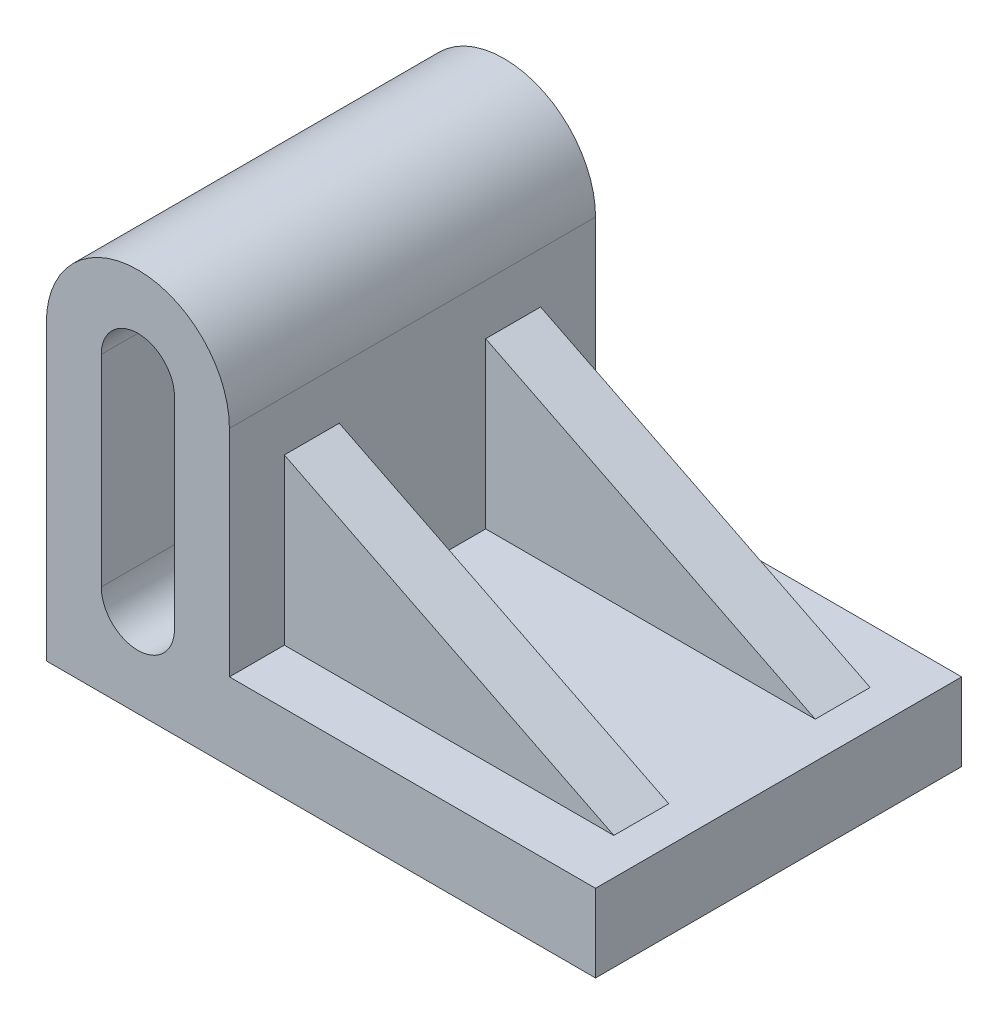
ISO-10303-21;
HEADER;
FILE_DESCRIPTION(('STEP AP214'),'2;1');
FILE_NAME('part.step','',(''),(''),'','','');
FILE_SCHEMA(('AUTOMOTIVE_DESIGN { 1 0 10303 214 1 1 1 1 }'));
ENDSEC;
DATA;
#1=APPLICATION_CONTEXT('core data for automotive mechanical design processes');
#2=APPLICATION_PROTOCOL_DEFINITION('international standard','automotive_design',2000,#1);
#3=PRODUCT_CONTEXT('',#1,'mechanical');
#4=PRODUCT('Part','Part','',(#3));
#5=PRODUCT_RELATED_PRODUCT_CATEGORY('part','',(#4));
#6=PRODUCT_DEFINITION_FORMATION('','',#4);
#7=PRODUCT_DEFINITION_CONTEXT('part definition',#1,'design');
#8=PRODUCT_DEFINITION('design','',#6,#7);
#9=PRODUCT_DEFINITION_SHAPE('','',#8);
#10=(LENGTH_UNIT() NAMED_UNIT(*) SI_UNIT(.MILLI.,.METRE.));
#11=(NAMED_UNIT(*) PLANE_ANGLE_UNIT() SI_UNIT($,.RADIAN.));
#12=(NAMED_UNIT(*) SI_UNIT($,.STERADIAN.) SOLID_ANGLE_UNIT());
#13=UNCERTAINTY_MEASURE_WITH_UNIT(LENGTH_MEASURE(1.E-05),#10,'distance_accuracy_value','');
#14=(GEOMETRIC_REPRESENTATION_CONTEXT(3) GLOBAL_UNCERTAINTY_ASSIGNED_CONTEXT((#13)) GLOBAL_UNIT_ASSIGNED_CONTEXT((#10,
#11,#12)) REPRESENTATION_CONTEXT('',''));
#15=CARTESIAN_POINT('',(0.,0.,0.));
#16=DIRECTION('',(0.,0.,1.));
#17=DIRECTION('',(1.,0.,0.));
#18=AXIS2_PLACEMENT_3D('',#15,#16,#17);
#19=CARTESIAN_POINT('',(140.,21.2228289339933,-35.));
#20=DIRECTION('',(0.447213595499958,0.894427190999916,0.));
#21=DIRECTION('',(-0.894427190999916,0.447213595499958,0.));
#22=AXIS2_PLACEMENT_3D('',#19,#20,#21);
#23=PLANE('',#22);
#24=DIRECTION('',(0.,0.,1.));
#25=VECTOR('',#24,1.);
#26=CARTESIAN_POINT('',(140.,21.2228289339933,-35.));
#27=LINE('',#26,#25);
#28=CARTESIAN_POINT('',(140.,21.2228289339933,20.));
#29=VERTEX_POINT('',#28);
#30=CARTESIAN_POINT('',(140.,21.2228289339933,35.));
#31=VERTEX_POINT('',#30);
#32=EDGE_CURVE('E194',#29,#31,#27,.T.);
#33=ORIENTED_EDGE('',*,*,#32,.F.);
#34=DIRECTION('',(-0.894427190999916,0.447213595499958,0.));
#35=VECTOR('',#34,1.);
#36=CARTESIAN_POINT('',(140.,21.2228289339933,20.));
#37=LINE('',#36,#35);
#38=CARTESIAN_POINT('',(50.,66.2228289339933,20.));
#39=VERTEX_POINT('',#38);
#40=EDGE_CURVE('E11',#29,#39,#37,.T.);
#41=ORIENTED_EDGE('',*,*,#40,.T.);
#42=DIRECTION('',(0.,0.,1.));
#43=VECTOR('',#42,1.);
#44=CARTESIAN_POINT('',(50.,66.2228289339933,-35.));
#45=LINE('',#44,#43);
#46=CARTESIAN_POINT('',(50.,66.2228289339933,35.));
#47=VERTEX_POINT('',#46);
#48=EDGE_CURVE('E161',#39,#47,#45,.T.);
#49=ORIENTED_EDGE('',*,*,#48,.T.);
#50=DIRECTION('',(-0.894427190999916,0.447213595499958,0.));
#51=VECTOR('',#50,1.);
#52=CARTESIAN_POINT('',(140.,21.2228289339933,35.));
#53=LINE('',#52,#51);
#54=EDGE_CURVE('E162',#31,#47,#53,.T.);
#55=ORIENTED_EDGE('',*,*,#54,.F.);
#56=EDGE_LOOP('',(#33,#41,#49,#55));
#57=FACE_BOUND('',#56,.T.);
#58=ADVANCED_FACE('F39',(#57),#23,.T.);
#59=CARTESIAN_POINT('',(50.,66.2228289339933,-35.));
#60=VERTEX_POINT('',#59);
#61=CARTESIAN_POINT('',(50.,66.2228289339933,-20.));
#62=VERTEX_POINT('',#61);
#63=EDGE_CURVE('E198',#60,#62,#45,.T.);
#64=ORIENTED_EDGE('',*,*,#63,.T.);
#65=DIRECTION('',(0.894427190999916,-0.447213595499958,0.));
#66=VECTOR('',#65,1.);
#67=CARTESIAN_POINT('',(140.,21.2228289339933,-20.));
#68=LINE('',#67,#66);
#69=CARTESIAN_POINT('',(140.,21.2228289339933,-20.));
#70=VERTEX_POINT('',#69);
#71=EDGE_CURVE('E50',#62,#70,#68,.T.);
#72=ORIENTED_EDGE('',*,*,#71,.T.);
#73=CARTESIAN_POINT('',(140.,21.2228289339933,-35.));
#74=VERTEX_POINT('',#73);
#75=EDGE_CURVE('E195',#74,#70,#27,.T.);
#76=ORIENTED_EDGE('',*,*,#75,.F.);
#77=DIRECTION('',(-0.894427190999916,0.447213595499958,0.));
#78=VECTOR('',#77,1.);
#79=CARTESIAN_POINT('',(140.,21.2228289339933,-35.));
#80=LINE('',#79,#78);
#81=EDGE_CURVE('E64',#74,#60,#80,.T.);
#82=ORIENTED_EDGE('',*,*,#81,.T.);
#83=EDGE_LOOP('',(#64,#72,#76,#82));
#84=FACE_BOUND('',#83,.T.);
#85=ADVANCED_FACE('F275',(#84),#23,.T.);
#86=CARTESIAN_POINT('',(150.,21.2228289339933,50.));
#87=DIRECTION('',(0.,-1.,0.));
#88=DIRECTION('',(0.,0.,-1.));
#89=AXIS2_PLACEMENT_3D('',#86,#87,#88);
#90=PLANE('',#89);
#91=ORIENTED_EDGE('',*,*,#75,.T.);
#92=DIRECTION('',(-1.,0.,0.));
#93=VECTOR('',#92,1.);
#94=CARTESIAN_POINT('',(50.,21.2228289339933,-20.));
#95=LINE('',#94,#93);
#96=CARTESIAN_POINT('',(50.,21.2228289339933,-20.));
#97=VERTEX_POINT('',#96);
#98=EDGE_CURVE('E53',#70,#97,#95,.T.);
#99=ORIENTED_EDGE('',*,*,#98,.T.);
#100=DIRECTION('',(0.,0.,1.));
#101=VECTOR('',#100,1.);
#102=CARTESIAN_POINT('',(50.,21.2228289339933,-20.));
#103=LINE('',#102,#101);
#104=CARTESIAN_POINT('',(50.,21.2228289339933,20.));
#105=VERTEX_POINT('',#104);
#106=EDGE_CURVE('E157',#97,#105,#103,.T.);
#107=ORIENTED_EDGE('',*,*,#106,.T.);
#108=DIRECTION('',(1.,0.,0.));
#109=VECTOR('',#108,1.);
#110=CARTESIAN_POINT('',(50.,21.2228289339933,20.));
#111=LINE('',#110,#109);
#112=EDGE_CURVE('E170',#105,#29,#111,.T.);
#113=ORIENTED_EDGE('',*,*,#112,.T.);
#114=ORIENTED_EDGE('',*,*,#32,.T.);
#115=DIRECTION('',(1.,0.,0.));
#116=VECTOR('',#115,1.);
#117=CARTESIAN_POINT('',(50.,21.2228289339933,35.));
#118=LINE('',#117,#116);
#119=CARTESIAN_POINT('',(50.,21.2228289339933,35.));
#120=VERTEX_POINT('',#119);
#121=EDGE_CURVE('E185',#120,#31,#118,.T.);
#122=ORIENTED_EDGE('',*,*,#121,.F.);
#123=DIRECTION('',(0.,0.,-1.));
#124=VECTOR('',#123,1.);
#125=CARTESIAN_POINT('',(50.,21.2228289339933,50.));
#126=LINE('',#125,#124);
#127=CARTESIAN_POINT('',(50.,21.2228289339933,50.));
#128=VERTEX_POINT('',#127);
#129=EDGE_CURVE('E262',#128,#120,#126,.T.);
#130=ORIENTED_EDGE('',*,*,#129,.F.);
#131=DIRECTION('',(-1.,0.,0.));
#132=VECTOR('',#131,1.);
#133=CARTESIAN_POINT('',(150.,21.2228289339933,50.));
#134=LINE('',#133,#132);
#135=CARTESIAN_POINT('',(150.,21.2228289339933,50.));
#136=VERTEX_POINT('',#135);
#137=EDGE_CURVE('E251',#136,#128,#134,.T.);
#138=ORIENTED_EDGE('',*,*,#137,.F.);
#139=DIRECTION('',(0.,0.,-1.));
#140=VECTOR('',#139,1.);
#141=CARTESIAN_POINT('',(150.,21.2228289339933,50.));
#142=LINE('',#141,#140);
#143=CARTESIAN_POINT('',(150.,21.2228289339933,-50.));
#144=VERTEX_POINT('',#143);
#145=EDGE_CURVE('E270',#136,#144,#142,.T.);
#146=ORIENTED_EDGE('',*,*,#145,.T.);
#147=DIRECTION('',(-1.,0.,0.));
#148=VECTOR('',#147,1.);
#149=CARTESIAN_POINT('',(150.,21.2228289339933,-50.));
#150=LINE('',#149,#148);
#151=CARTESIAN_POINT('',(50.,21.2228289339933,-50.));
#152=VERTEX_POINT('',#151);
#153=EDGE_CURVE('E236',#144,#152,#150,.T.);
#154=ORIENTED_EDGE('',*,*,#153,.T.);
#155=CARTESIAN_POINT('',(50.,21.2228289339933,-35.));
#156=VERTEX_POINT('',#155);
#157=EDGE_CURVE('E263',#156,#152,#126,.T.);
#158=ORIENTED_EDGE('',*,*,#157,.F.);
#159=DIRECTION('',(1.,0.,0.));
#160=VECTOR('',#159,1.);
#161=CARTESIAN_POINT('',(50.,21.2228289339933,-35.));
#162=LINE('',#161,#160);
#163=EDGE_CURVE('E190',#156,#74,#162,.T.);
#164=ORIENTED_EDGE('',*,*,#163,.T.);
#165=EDGE_LOOP('',(#91,#99,#107,#113,#114,#122,#130,#138,#146,#154,#158,#164));
#166=FACE_BOUND('',#165,.T.);
#167=ADVANCED_FACE('F172',(#166),#90,.F.);
#168=CARTESIAN_POINT('',(50.,21.2228289339933,50.));
#169=DIRECTION('',(-1.,0.,0.));
#170=DIRECTION('',(0.,0.,1.));
#171=AXIS2_PLACEMENT_3D('',#168,#169,#170);
#172=PLANE('',#171);
#173=DIRECTION('',(0.,1.,0.));
#174=VECTOR('',#173,1.);
#175=CARTESIAN_POINT('',(50.,21.2228289339933,-50.));
#176=LINE('',#175,#174);
#177=CARTESIAN_POINT('',(50.,80.,-50.));
#178=VERTEX_POINT('',#177);
#179=EDGE_CURVE('E243',#152,#178,#176,.T.);
#180=ORIENTED_EDGE('',*,*,#179,.T.);
#181=DIRECTION('',(0.,0.,-1.));
#182=VECTOR('',#181,1.);
#183=CARTESIAN_POINT('',(50.,80.,50.));
#184=LINE('',#183,#182);
#185=CARTESIAN_POINT('',(50.,80.,50.));
#186=VERTEX_POINT('',#185);
#187=EDGE_CURVE('E261',#186,#178,#184,.T.);
#188=ORIENTED_EDGE('',*,*,#187,.F.);
#189=DIRECTION('',(0.,1.,0.));
#190=VECTOR('',#189,1.);
#191=CARTESIAN_POINT('',(50.,21.2228289339933,50.));
#192=LINE('',#191,#190);
#193=EDGE_CURVE('E254',#128,#186,#192,.T.);
#194=ORIENTED_EDGE('',*,*,#193,.F.);
#195=ORIENTED_EDGE('',*,*,#129,.T.);
#196=DIRECTION('',(0.,-1.,0.));
#197=VECTOR('',#196,1.);
#198=CARTESIAN_POINT('',(50.,66.2228289339933,35.));
#199=LINE('',#198,#197);
#200=EDGE_CURVE('E179',#47,#120,#199,.T.);
#201=ORIENTED_EDGE('',*,*,#200,.F.);
#202=ORIENTED_EDGE('',*,*,#48,.F.);
#203=DIRECTION('',(0.,-1.,0.));
#204=VECTOR('',#203,1.);
#205=CARTESIAN_POINT('',(50.,105.,20.));
#206=LINE('',#205,#204);
#207=EDGE_CURVE('E153',#39,#105,#206,.T.);
#208=ORIENTED_EDGE('',*,*,#207,.T.);
#209=ORIENTED_EDGE('',*,*,#106,.F.);
#210=DIRECTION('',(0.,-1.,0.));
#211=VECTOR('',#210,1.);
#212=CARTESIAN_POINT('',(50.,105.,-20.));
#213=LINE('',#212,#211);
#214=EDGE_CURVE('E163',#62,#97,#213,.T.);
#215=ORIENTED_EDGE('',*,*,#214,.F.);
#216=ORIENTED_EDGE('',*,*,#63,.F.);
#217=DIRECTION('',(0.,-1.,0.));
#218=VECTOR('',#217,1.);
#219=CARTESIAN_POINT('',(50.,66.2228289339933,-35.));
#220=LINE('',#219,#218);
#221=EDGE_CURVE('E188',#60,#156,#220,.T.);
#222=ORIENTED_EDGE('',*,*,#221,.T.);
#223=ORIENTED_EDGE('',*,*,#157,.T.);
#224=EDGE_LOOP('',(#180,#188,#194,#195,#201,#202,#208,#209,#215,#216,#222,#223));
#225=FACE_BOUND('',#224,.T.);
#226=ADVANCED_FACE('F156',(#225),#172,.F.);
#227=CARTESIAN_POINT('',(0.,0.,50.));
#228=DIRECTION('',(1.,0.,0.));
#229=DIRECTION('',(0.,0.,-1.));
#230=AXIS2_PLACEMENT_3D('',#227,#228,#229);
#231=PLANE('',#230);
#232=DIRECTION('',(0.,0.,-1.));
#233=VECTOR('',#232,1.);
#234=CARTESIAN_POINT('',(0.,80.,50.));
#235=LINE('',#234,#233);
#236=CARTESIAN_POINT('',(0.,80.,50.));
#237=VERTEX_POINT('',#236);
#238=CARTESIAN_POINT('',(0.,80.,-50.));
#239=VERTEX_POINT('',#238);
#240=EDGE_CURVE('E259',#237,#239,#235,.T.);
#241=ORIENTED_EDGE('',*,*,#240,.T.);
#242=DIRECTION('',(0.,-1.,0.));
#243=VECTOR('',#242,1.);
#244=CARTESIAN_POINT('',(0.,0.,-50.));
#245=LINE('',#244,#243);
#246=CARTESIAN_POINT('',(0.,0.,-50.));
#247=VERTEX_POINT('',#246);
#248=EDGE_CURVE('E224',#239,#247,#245,.T.);
#249=ORIENTED_EDGE('',*,*,#248,.T.);
#250=DIRECTION('',(0.,0.,-1.));
#251=VECTOR('',#250,1.);
#252=CARTESIAN_POINT('',(0.,0.,50.));
#253=LINE('',#252,#251);
#254=CARTESIAN_POINT('',(0.,0.,50.));
#255=VERTEX_POINT('',#254);
#256=EDGE_CURVE('E271',#255,#247,#253,.T.);
#257=ORIENTED_EDGE('',*,*,#256,.F.);
#258=DIRECTION('',(0.,-1.,0.));
#259=VECTOR('',#258,1.);
#260=CARTESIAN_POINT('',(0.,0.,50.));
#261=LINE('',#260,#259);
#262=EDGE_CURVE('E246',#237,#255,#261,.T.);
#263=ORIENTED_EDGE('',*,*,#262,.F.);
#264=EDGE_LOOP('',(#241,#249,#257,#263));
#265=FACE_BOUND('',#264,.T.);
#266=ADVANCED_FACE('F41',(#265),#231,.F.);
#267=CARTESIAN_POINT('',(0.,0.,50.));
#268=DIRECTION('',(0.,1.,0.));
#269=DIRECTION('',(0.,0.,1.));
#270=AXIS2_PLACEMENT_3D('',#267,#268,#269);
#271=PLANE('',#270);
#272=ORIENTED_EDGE('',*,*,#256,.T.);
#273=DIRECTION('',(1.,0.,0.));
#274=VECTOR('',#273,1.);
#275=CARTESIAN_POINT('',(0.,0.,-50.));
#276=LINE('',#275,#274);
#277=CARTESIAN_POINT('',(150.,0.,-50.));
#278=VERTEX_POINT('',#277);
#279=EDGE_CURVE('E235',#247,#278,#276,.T.);
#280=ORIENTED_EDGE('',*,*,#279,.T.);
#281=DIRECTION('',(0.,0.,-1.));
#282=VECTOR('',#281,1.);
#283=CARTESIAN_POINT('',(150.,0.,50.));
#284=LINE('',#283,#282);
#285=CARTESIAN_POINT('',(150.,0.,50.));
#286=VERTEX_POINT('',#285);
#287=EDGE_CURVE('E267',#286,#278,#284,.T.);
#288=ORIENTED_EDGE('',*,*,#287,.F.);
#289=DIRECTION('',(1.,0.,0.));
#290=VECTOR('',#289,1.);
#291=CARTESIAN_POINT('',(0.,0.,50.));
#292=LINE('',#291,#290);
#293=EDGE_CURVE('E248',#255,#286,#292,.T.);
#294=ORIENTED_EDGE('',*,*,#293,.F.);
#295=EDGE_LOOP('',(#272,#280,#288,#294));
#296=FACE_BOUND('',#295,.T.);
#297=ADVANCED_FACE('F329',(#296),#271,.F.);
#298=CARTESIAN_POINT('',(150.,0.,50.));
#299=DIRECTION('',(-1.,0.,0.));
#300=DIRECTION('',(0.,0.,1.));
#301=AXIS2_PLACEMENT_3D('',#298,#299,#300);
#302=PLANE('',#301);
#303=ORIENTED_EDGE('',*,*,#287,.T.);
#304=DIRECTION('',(0.,1.,0.));
#305=VECTOR('',#304,1.);
#306=CARTESIAN_POINT('',(150.,0.,-50.));
#307=LINE('',#306,#305);
#308=EDGE_CURVE('E234',#278,#144,#307,.T.);
#309=ORIENTED_EDGE('',*,*,#308,.T.);
#310=ORIENTED_EDGE('',*,*,#145,.F.);
#311=DIRECTION('',(0.,1.,0.));
#312=VECTOR('',#311,1.);
#313=CARTESIAN_POINT('',(150.,0.,50.));
#314=LINE('',#313,#312);
#315=EDGE_CURVE('E253',#286,#136,#314,.T.);
#316=ORIENTED_EDGE('',*,*,#315,.F.);
#317=EDGE_LOOP('',(#303,#309,#310,#316));
#318=FACE_BOUND('',#317,.T.);
#319=ADVANCED_FACE('F323',(#318),#302,.F.);
#320=CARTESIAN_POINT('',(25.,80.,50.));
#321=DIRECTION('',(0.,0.,-1.));
#322=DIRECTION('',(-1.,0.,0.));
#323=AXIS2_PLACEMENT_3D('',#320,#321,#322);
#324=CYLINDRICAL_SURFACE('',#323,25.);
#325=ORIENTED_EDGE('',*,*,#187,.T.);
#326=CARTESIAN_POINT('',(25.,80.,-50.));
#327=DIRECTION('',(0.,0.,1.));
#328=DIRECTION('',(1.,0.,0.));
#329=AXIS2_PLACEMENT_3D('',#326,#327,#328);
#330=CIRCLE('',#329,25.);
#331=EDGE_CURVE('E242',#178,#239,#330,.T.);
#332=ORIENTED_EDGE('',*,*,#331,.T.);
#333=ORIENTED_EDGE('',*,*,#240,.F.);
#334=CARTESIAN_POINT('',(25.,80.,50.));
#335=DIRECTION('',(0.,0.,1.));
#336=DIRECTION('',(1.,0.,0.));
#337=AXIS2_PLACEMENT_3D('',#334,#335,#336);
#338=CIRCLE('',#337,25.);
#339=EDGE_CURVE('E260',#186,#237,#338,.T.);
#340=ORIENTED_EDGE('',*,*,#339,.F.);
#341=EDGE_LOOP('',(#325,#332,#333,#340));
#342=FACE_BOUND('',#341,.T.);
#343=ADVANCED_FACE('F317',(#342),#324,.T.);
#344=CARTESIAN_POINT('',(25.,80.,50.));
#345=DIRECTION('',(0.,0.,1.));
#346=DIRECTION('',(1.,0.,0.));
#347=AXIS2_PLACEMENT_3D('',#344,#345,#346);
#348=PLANE('',#347);
#349=CARTESIAN_POINT('',(25.,80.,50.));
#350=DIRECTION('',(0.,0.,1.));
#351=DIRECTION('',(1.,0.,0.));
#352=AXIS2_PLACEMENT_3D('',#349,#350,#351);
#353=CIRCLE('',#352,9.99999999999999);
#354=CARTESIAN_POINT('',(35.,80.,50.));
#355=VERTEX_POINT('',#354);
#356=CARTESIAN_POINT('',(15.,80.,50.));
#357=VERTEX_POINT('',#356);
#358=EDGE_CURVE('E193',#355,#357,#353,.T.);
#359=ORIENTED_EDGE('',*,*,#358,.F.);
#360=DIRECTION('',(0.,1.,0.));
#361=VECTOR('',#360,1.);
#362=CARTESIAN_POINT('',(35.,80.,50.));
#363=LINE('',#362,#361);
#364=CARTESIAN_POINT('',(35.,25.,50.));
#365=VERTEX_POINT('',#364);
#366=EDGE_CURVE('E205',#365,#355,#363,.T.);
#367=ORIENTED_EDGE('',*,*,#366,.F.);
#368=CARTESIAN_POINT('',(25.,25.,50.));
#369=DIRECTION('',(0.,0.,1.));
#370=DIRECTION('',(1.,0.,0.));
#371=AXIS2_PLACEMENT_3D('',#368,#369,#370);
#372=CIRCLE('',#371,10.);
#373=CARTESIAN_POINT('',(15.,25.,50.));
#374=VERTEX_POINT('',#373);
#375=EDGE_CURVE('E216',#374,#365,#372,.T.);
#376=ORIENTED_EDGE('',*,*,#375,.F.);
#377=DIRECTION('',(0.,-1.,0.));
#378=VECTOR('',#377,1.);
#379=CARTESIAN_POINT('',(15.,80.,50.));
#380=LINE('',#379,#378);
#381=EDGE_CURVE('E213',#357,#374,#380,.T.);
#382=ORIENTED_EDGE('',*,*,#381,.F.);
#383=EDGE_LOOP('',(#359,#367,#376,#382));
#384=FACE_BOUND('',#383,.T.);
#385=ORIENTED_EDGE('',*,*,#262,.T.);
#386=ORIENTED_EDGE('',*,*,#293,.T.);
#387=ORIENTED_EDGE('',*,*,#315,.T.);
#388=ORIENTED_EDGE('',*,*,#137,.T.);
#389=ORIENTED_EDGE('',*,*,#193,.T.);
#390=ORIENTED_EDGE('',*,*,#339,.T.);
#391=EDGE_LOOP('',(#385,#386,#387,#388,#389,#390));
#392=FACE_BOUND('',#391,.T.);
#393=ADVANCED_FACE('F312',(#384,#392),#348,.T.);
#394=CARTESIAN_POINT('',(25.,80.,-50.));
#395=DIRECTION('',(0.,0.,1.));
#396=DIRECTION('',(1.,0.,0.));
#397=AXIS2_PLACEMENT_3D('',#394,#395,#396);
#398=PLANE('',#397);
#399=DIRECTION('',(0.,1.,0.));
#400=VECTOR('',#399,1.);
#401=CARTESIAN_POINT('',(35.,80.,-50.));
#402=LINE('',#401,#400);
#403=CARTESIAN_POINT('',(35.,25.,-50.));
#404=VERTEX_POINT('',#403);
#405=CARTESIAN_POINT('',(35.,80.,-50.));
#406=VERTEX_POINT('',#405);
#407=EDGE_CURVE('E208',#404,#406,#402,.T.);
#408=ORIENTED_EDGE('',*,*,#407,.T.);
#409=CARTESIAN_POINT('',(25.,80.,-50.));
#410=DIRECTION('',(0.,0.,1.));
#411=DIRECTION('',(1.,0.,0.));
#412=AXIS2_PLACEMENT_3D('',#409,#410,#411);
#413=CIRCLE('',#412,9.99999999999999);
#414=CARTESIAN_POINT('',(15.,80.,-50.));
#415=VERTEX_POINT('',#414);
#416=EDGE_CURVE('E196',#406,#415,#413,.T.);
#417=ORIENTED_EDGE('',*,*,#416,.T.);
#418=DIRECTION('',(0.,-1.,0.));
#419=VECTOR('',#418,1.);
#420=CARTESIAN_POINT('',(15.,80.,-50.));
#421=LINE('',#420,#419);
#422=CARTESIAN_POINT('',(15.,25.,-50.));
#423=VERTEX_POINT('',#422);
#424=EDGE_CURVE('E203',#415,#423,#421,.T.);
#425=ORIENTED_EDGE('',*,*,#424,.T.);
#426=CARTESIAN_POINT('',(25.,25.,-50.));
#427=DIRECTION('',(0.,0.,1.));
#428=DIRECTION('',(1.,0.,0.));
#429=AXIS2_PLACEMENT_3D('',#426,#427,#428);
#430=CIRCLE('',#429,10.);
#431=EDGE_CURVE('E202',#423,#404,#430,.T.);
#432=ORIENTED_EDGE('',*,*,#431,.T.);
#433=EDGE_LOOP('',(#408,#417,#425,#432));
#434=FACE_BOUND('',#433,.T.);
#435=ORIENTED_EDGE('',*,*,#248,.F.);
#436=ORIENTED_EDGE('',*,*,#331,.F.);
#437=ORIENTED_EDGE('',*,*,#179,.F.);
#438=ORIENTED_EDGE('',*,*,#153,.F.);
#439=ORIENTED_EDGE('',*,*,#308,.F.);
#440=ORIENTED_EDGE('',*,*,#279,.F.);
#441=EDGE_LOOP('',(#435,#436,#437,#438,#439,#440));
#442=FACE_BOUND('',#441,.T.);
#443=ADVANCED_FACE('F313',(#434,#442),#398,.F.);
#444=CARTESIAN_POINT('',(25.,80.,-50.));
#445=DIRECTION('',(0.,0.,1.));
#446=DIRECTION('',(1.,0.,0.));
#447=AXIS2_PLACEMENT_3D('',#444,#445,#446);
#448=CYLINDRICAL_SURFACE('',#447,9.99999999999999);
#449=ORIENTED_EDGE('',*,*,#358,.T.);
#450=DIRECTION('',(0.,0.,1.));
#451=VECTOR('',#450,1.);
#452=CARTESIAN_POINT('',(15.,80.,-50.));
#453=LINE('',#452,#451);
#454=EDGE_CURVE('E211',#415,#357,#453,.T.);
#455=ORIENTED_EDGE('',*,*,#454,.F.);
#456=ORIENTED_EDGE('',*,*,#416,.F.);
#457=DIRECTION('',(0.,0.,1.));
#458=VECTOR('',#457,1.);
#459=CARTESIAN_POINT('',(35.,80.,-50.));
#460=LINE('',#459,#458);
#461=EDGE_CURVE('E222',#406,#355,#460,.T.);
#462=ORIENTED_EDGE('',*,*,#461,.T.);
#463=EDGE_LOOP('',(#449,#455,#456,#462));
#464=FACE_BOUND('',#463,.T.);
#465=ADVANCED_FACE('F296',(#464),#448,.F.);
#466=CARTESIAN_POINT('',(35.,80.,-50.));
#467=DIRECTION('',(1.,0.,0.));
#468=DIRECTION('',(0.,1.,0.));
#469=AXIS2_PLACEMENT_3D('',#466,#467,#468);
#470=PLANE('',#469);
#471=ORIENTED_EDGE('',*,*,#366,.T.);
#472=ORIENTED_EDGE('',*,*,#461,.F.);
#473=ORIENTED_EDGE('',*,*,#407,.F.);
#474=DIRECTION('',(0.,0.,1.));
#475=VECTOR('',#474,1.);
#476=CARTESIAN_POINT('',(35.,25.,-50.));
#477=LINE('',#476,#475);
#478=EDGE_CURVE('E221',#404,#365,#477,.T.);
#479=ORIENTED_EDGE('',*,*,#478,.T.);
#480=EDGE_LOOP('',(#471,#472,#473,#479));
#481=FACE_BOUND('',#480,.T.);
#482=ADVANCED_FACE('F298',(#481),#470,.F.);
#483=CARTESIAN_POINT('',(25.,25.,-50.));
#484=DIRECTION('',(0.,0.,1.));
#485=DIRECTION('',(1.,0.,0.));
#486=AXIS2_PLACEMENT_3D('',#483,#484,#485);
#487=CYLINDRICAL_SURFACE('',#486,10.);
#488=ORIENTED_EDGE('',*,*,#375,.T.);
#489=ORIENTED_EDGE('',*,*,#478,.F.);
#490=ORIENTED_EDGE('',*,*,#431,.F.);
#491=DIRECTION('',(0.,0.,1.));
#492=VECTOR('',#491,1.);
#493=CARTESIAN_POINT('',(15.,25.,-50.));
#494=LINE('',#493,#492);
#495=EDGE_CURVE('E228',#423,#374,#494,.T.);
#496=ORIENTED_EDGE('',*,*,#495,.T.);
#497=EDGE_LOOP('',(#488,#489,#490,#496));
#498=FACE_BOUND('',#497,.T.);
#499=ADVANCED_FACE('F300',(#498),#487,.F.);
#500=CARTESIAN_POINT('',(15.,80.,-50.));
#501=DIRECTION('',(-1.,0.,0.));
#502=DIRECTION('',(0.,-1.,0.));
#503=AXIS2_PLACEMENT_3D('',#500,#501,#502);
#504=PLANE('',#503);
#505=ORIENTED_EDGE('',*,*,#381,.T.);
#506=ORIENTED_EDGE('',*,*,#495,.F.);
#507=ORIENTED_EDGE('',*,*,#424,.F.);
#508=ORIENTED_EDGE('',*,*,#454,.T.);
#509=EDGE_LOOP('',(#505,#506,#507,#508));
#510=FACE_BOUND('',#509,.T.);
#511=ADVANCED_FACE('F303',(#510),#504,.F.);
#512=CARTESIAN_POINT('',(0.,0.,-35.));
#513=DIRECTION('',(0.,0.,1.));
#514=DIRECTION('',(1.,0.,0.));
#515=AXIS2_PLACEMENT_3D('',#512,#513,#514);
#516=PLANE('',#515);
#517=ORIENTED_EDGE('',*,*,#81,.F.);
#518=ORIENTED_EDGE('',*,*,#163,.F.);
#519=ORIENTED_EDGE('',*,*,#221,.F.);
#520=EDGE_LOOP('',(#517,#518,#519));
#521=FACE_BOUND('',#520,.T.);
#522=ADVANCED_FACE('F277',(#521),#516,.F.);
#523=CARTESIAN_POINT('',(0.,0.,35.));
#524=DIRECTION('',(0.,0.,1.));
#525=DIRECTION('',(1.,0.,0.));
#526=AXIS2_PLACEMENT_3D('',#523,#524,#525);
#527=PLANE('',#526);
#528=ORIENTED_EDGE('',*,*,#54,.T.);
#529=ORIENTED_EDGE('',*,*,#200,.T.);
#530=ORIENTED_EDGE('',*,*,#121,.T.);
#531=EDGE_LOOP('',(#528,#529,#530));
#532=FACE_BOUND('',#531,.T.);
#533=ADVANCED_FACE('F285',(#532),#527,.T.);
#534=CARTESIAN_POINT('',(50.,105.,20.));
#535=DIRECTION('',(0.,0.,-1.));
#536=DIRECTION('',(-1.,0.,0.));
#537=AXIS2_PLACEMENT_3D('',#534,#535,#536);
#538=PLANE('',#537);
#539=ORIENTED_EDGE('',*,*,#112,.F.);
#540=ORIENTED_EDGE('',*,*,#207,.F.);
#541=ORIENTED_EDGE('',*,*,#40,.F.);
#542=EDGE_LOOP('',(#539,#540,#541));
#543=FACE_BOUND('',#542,.T.);
#544=ADVANCED_FACE('F169',(#543),#538,.T.);
#545=CARTESIAN_POINT('',(50.,105.,-20.));
#546=DIRECTION('',(0.,0.,1.));
#547=DIRECTION('',(1.,0.,0.));
#548=AXIS2_PLACEMENT_3D('',#545,#546,#547);
#549=PLANE('',#548);
#550=ORIENTED_EDGE('',*,*,#214,.T.);
#551=ORIENTED_EDGE('',*,*,#98,.F.);
#552=ORIENTED_EDGE('',*,*,#71,.F.);
#553=EDGE_LOOP('',(#550,#551,#552));
#554=FACE_BOUND('',#553,.T.);
#555=ADVANCED_FACE('F279',(#554),#549,.T.);
#556=CLOSED_SHELL('',(#58,#85,#167,#226,#266,#297,#319,#343,#393,#443,#465,#482,#499,#511,#522,
#533,#544,#555));
#557=MANIFOLD_SOLID_BREP('B2',#556);
#558=ADVANCED_BREP_SHAPE_REPRESENTATION('',(#18,#557),#14);
#559=SHAPE_DEFINITION_REPRESENTATION(#9,#558);
ENDSEC;
END-ISO-10303-21;
